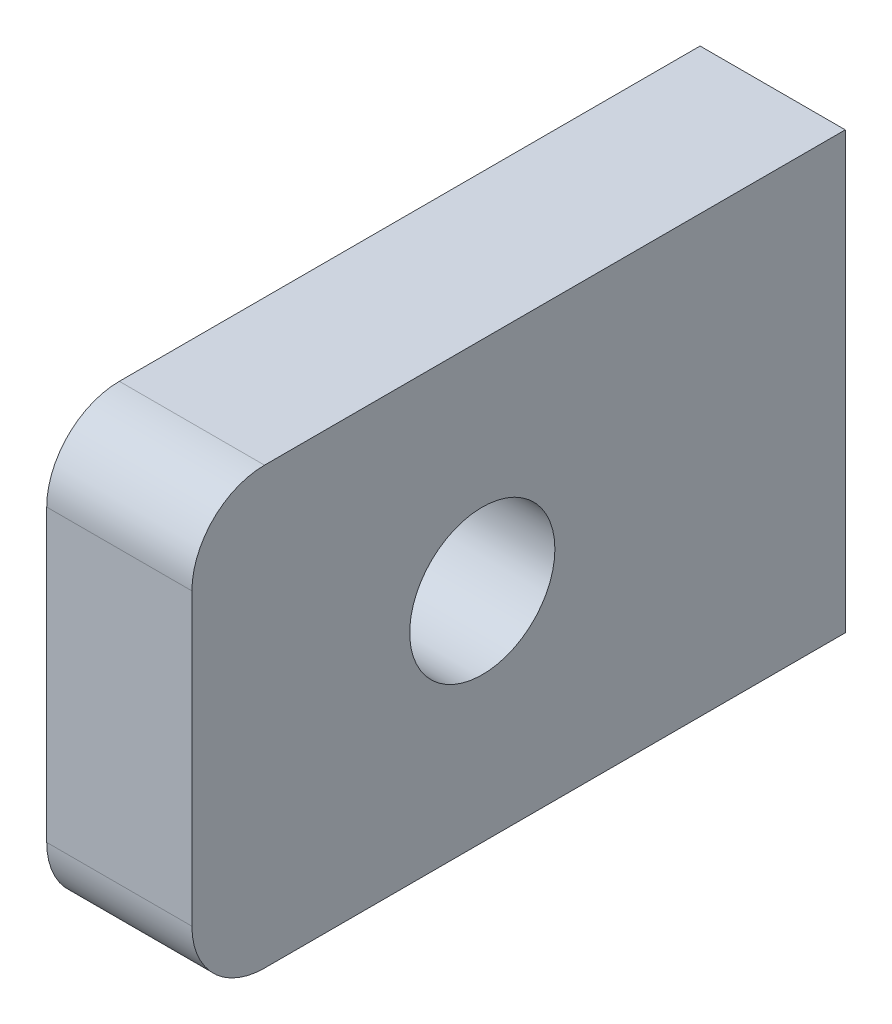
ISO-10303-21;
HEADER;
FILE_DESCRIPTION(('STEP AP214'),'2;1');
FILE_NAME('part.step','',(''),(''),'','','');
FILE_SCHEMA(('AUTOMOTIVE_DESIGN { 1 0 10303 214 1 1 1 1 }'));
ENDSEC;
DATA;
#1=APPLICATION_CONTEXT('core data for automotive mechanical design processes');
#2=APPLICATION_PROTOCOL_DEFINITION('international standard','automotive_design',2000,#1);
#3=PRODUCT_CONTEXT('',#1,'mechanical');
#4=PRODUCT('Part','Part','',(#3));
#5=PRODUCT_RELATED_PRODUCT_CATEGORY('part','',(#4));
#6=PRODUCT_DEFINITION_FORMATION('','',#4);
#7=PRODUCT_DEFINITION_CONTEXT('part definition',#1,'design');
#8=PRODUCT_DEFINITION('design','',#6,#7);
#9=PRODUCT_DEFINITION_SHAPE('','',#8);
#10=(LENGTH_UNIT() NAMED_UNIT(*) SI_UNIT(.MILLI.,.METRE.));
#11=(NAMED_UNIT(*) PLANE_ANGLE_UNIT() SI_UNIT($,.RADIAN.));
#12=(NAMED_UNIT(*) SI_UNIT($,.STERADIAN.) SOLID_ANGLE_UNIT());
#13=UNCERTAINTY_MEASURE_WITH_UNIT(LENGTH_MEASURE(1.E-05),#10,'distance_accuracy_value','');
#14=(GEOMETRIC_REPRESENTATION_CONTEXT(3) GLOBAL_UNCERTAINTY_ASSIGNED_CONTEXT((#13)) GLOBAL_UNIT_ASSIGNED_CONTEXT((#10,
#11,#12)) REPRESENTATION_CONTEXT('',''));
#15=CARTESIAN_POINT('',(0.,0.,0.));
#16=DIRECTION('',(0.,0.,1.));
#17=DIRECTION('',(1.,0.,0.));
#18=AXIS2_PLACEMENT_3D('',#15,#16,#17);
#19=CARTESIAN_POINT('',(20.,60.,-90.));
#20=DIRECTION('',(0.,0.,1.));
#21=DIRECTION('',(0.,-1.,0.));
#22=AXIS2_PLACEMENT_3D('',#19,#20,#21);
#23=PLANE('',#22);
#24=DIRECTION('',(0.,1.,0.));
#25=VECTOR('',#24,1.);
#26=CARTESIAN_POINT('',(-20.,60.,-90.));
#27=LINE('',#26,#25);
#28=CARTESIAN_POINT('',(-20.,-60.,-90.));
#29=VERTEX_POINT('',#28);
#30=CARTESIAN_POINT('',(-20.,60.,-90.));
#31=VERTEX_POINT('',#30);
#32=EDGE_CURVE('E93',#29,#31,#27,.T.);
#33=ORIENTED_EDGE('',*,*,#32,.T.);
#34=DIRECTION('',(-1.,0.,0.));
#35=VECTOR('',#34,1.);
#36=CARTESIAN_POINT('',(20.,60.,-90.));
#37=LINE('',#36,#35);
#38=CARTESIAN_POINT('',(20.,60.,-90.));
#39=VERTEX_POINT('',#38);
#40=EDGE_CURVE('E74',#39,#31,#37,.T.);
#41=ORIENTED_EDGE('',*,*,#40,.F.);
#42=DIRECTION('',(0.,1.,0.));
#43=VECTOR('',#42,1.);
#44=CARTESIAN_POINT('',(20.,60.,-90.));
#45=LINE('',#44,#43);
#46=CARTESIAN_POINT('',(20.,-60.,-90.));
#47=VERTEX_POINT('',#46);
#48=EDGE_CURVE('E80',#47,#39,#45,.T.);
#49=ORIENTED_EDGE('',*,*,#48,.F.);
#50=DIRECTION('',(-1.,0.,0.));
#51=VECTOR('',#50,1.);
#52=CARTESIAN_POINT('',(20.,-60.,-90.));
#53=LINE('',#52,#51);
#54=EDGE_CURVE('E96',#47,#29,#53,.T.);
#55=ORIENTED_EDGE('',*,*,#54,.T.);
#56=EDGE_LOOP('',(#33,#41,#49,#55));
#57=FACE_BOUND('',#56,.T.);
#58=ADVANCED_FACE('F17',(#57),#23,.F.);
#59=CARTESIAN_POINT('',(20.,60.,90.));
#60=DIRECTION('',(0.,-1.,0.));
#61=DIRECTION('',(0.,0.,-1.));
#62=AXIS2_PLACEMENT_3D('',#59,#60,#61);
#63=PLANE('',#62);
#64=DIRECTION('',(0.,0.,1.));
#65=VECTOR('',#64,1.);
#66=CARTESIAN_POINT('',(-20.,60.,90.));
#67=LINE('',#66,#65);
#68=CARTESIAN_POINT('',(-20.,60.,70.));
#69=VERTEX_POINT('',#68);
#70=EDGE_CURVE('E138',#31,#69,#67,.T.);
#71=ORIENTED_EDGE('',*,*,#70,.T.);
#72=DIRECTION('',(-1.,0.,0.));
#73=VECTOR('',#72,1.);
#74=CARTESIAN_POINT('',(20.,60.,70.));
#75=LINE('',#74,#73);
#76=CARTESIAN_POINT('',(20.,60.,70.));
#77=VERTEX_POINT('',#76);
#78=EDGE_CURVE('E11',#69,#77,#75,.F.);
#79=ORIENTED_EDGE('',*,*,#78,.T.);
#80=DIRECTION('',(0.,0.,1.));
#81=VECTOR('',#80,1.);
#82=CARTESIAN_POINT('',(20.,60.,90.));
#83=LINE('',#82,#81);
#84=EDGE_CURVE('E70',#39,#77,#83,.T.);
#85=ORIENTED_EDGE('',*,*,#84,.F.);
#86=ORIENTED_EDGE('',*,*,#40,.T.);
#87=EDGE_LOOP('',(#71,#79,#85,#86));
#88=FACE_BOUND('',#87,.T.);
#89=ADVANCED_FACE('F72',(#88),#63,.F.);
#90=CARTESIAN_POINT('',(20.,60.,90.));
#91=DIRECTION('',(0.,0.,-1.));
#92=DIRECTION('',(0.,1.,0.));
#93=AXIS2_PLACEMENT_3D('',#90,#91,#92);
#94=PLANE('',#93);
#95=DIRECTION('',(0.,-1.,0.));
#96=VECTOR('',#95,1.);
#97=CARTESIAN_POINT('',(-20.,60.,90.));
#98=LINE('',#97,#96);
#99=CARTESIAN_POINT('',(-20.,40.,90.));
#100=VERTEX_POINT('',#99);
#101=CARTESIAN_POINT('',(-20.,-40.,90.));
#102=VERTEX_POINT('',#101);
#103=EDGE_CURVE('E134',#100,#102,#98,.T.);
#104=ORIENTED_EDGE('',*,*,#103,.T.);
#105=DIRECTION('',(-1.,0.,0.));
#106=VECTOR('',#105,1.);
#107=CARTESIAN_POINT('',(20.,-40.,90.));
#108=LINE('',#107,#106);
#109=CARTESIAN_POINT('',(20.,-40.,90.));
#110=VERTEX_POINT('',#109);
#111=EDGE_CURVE('E39',#102,#110,#108,.F.);
#112=ORIENTED_EDGE('',*,*,#111,.T.);
#113=DIRECTION('',(0.,-1.,0.));
#114=VECTOR('',#113,1.);
#115=CARTESIAN_POINT('',(20.,60.,90.));
#116=LINE('',#115,#114);
#117=CARTESIAN_POINT('',(20.,40.,90.));
#118=VERTEX_POINT('',#117);
#119=EDGE_CURVE('E79',#118,#110,#116,.T.);
#120=ORIENTED_EDGE('',*,*,#119,.F.);
#121=DIRECTION('',(-1.,0.,0.));
#122=VECTOR('',#121,1.);
#123=CARTESIAN_POINT('',(20.,40.,90.));
#124=LINE('',#123,#122);
#125=EDGE_CURVE('E114',#118,#100,#124,.T.);
#126=ORIENTED_EDGE('',*,*,#125,.T.);
#127=EDGE_LOOP('',(#104,#112,#120,#126));
#128=FACE_BOUND('',#127,.T.);
#129=ADVANCED_FACE('F135',(#128),#94,.F.);
#130=CARTESIAN_POINT('',(20.,-60.,90.));
#131=DIRECTION('',(0.,1.,0.));
#132=DIRECTION('',(0.,0.,1.));
#133=AXIS2_PLACEMENT_3D('',#130,#131,#132);
#134=PLANE('',#133);
#135=DIRECTION('',(0.,0.,-1.));
#136=VECTOR('',#135,1.);
#137=CARTESIAN_POINT('',(20.,-60.,90.));
#138=LINE('',#137,#136);
#139=CARTESIAN_POINT('',(20.,-60.,70.));
#140=VERTEX_POINT('',#139);
#141=EDGE_CURVE('E85',#140,#47,#138,.T.);
#142=ORIENTED_EDGE('',*,*,#141,.F.);
#143=DIRECTION('',(-1.,0.,0.));
#144=VECTOR('',#143,1.);
#145=CARTESIAN_POINT('',(20.,-60.,70.));
#146=LINE('',#145,#144);
#147=CARTESIAN_POINT('',(-20.,-60.,70.));
#148=VERTEX_POINT('',#147);
#149=EDGE_CURVE('E95',#140,#148,#146,.T.);
#150=ORIENTED_EDGE('',*,*,#149,.T.);
#151=DIRECTION('',(0.,0.,-1.));
#152=VECTOR('',#151,1.);
#153=CARTESIAN_POINT('',(-20.,-60.,90.));
#154=LINE('',#153,#152);
#155=EDGE_CURVE('E90',#148,#29,#154,.T.);
#156=ORIENTED_EDGE('',*,*,#155,.T.);
#157=ORIENTED_EDGE('',*,*,#54,.F.);
#158=EDGE_LOOP('',(#142,#150,#156,#157));
#159=FACE_BOUND('',#158,.T.);
#160=ADVANCED_FACE('F126',(#159),#134,.F.);
#161=CARTESIAN_POINT('',(20.,0.,0.));
#162=DIRECTION('',(1.,0.,0.));
#163=DIRECTION('',(0.,0.,-1.));
#164=AXIS2_PLACEMENT_3D('',#161,#162,#163);
#165=PLANE('',#164);
#166=CARTESIAN_POINT('',(20.,0.,10.));
#167=DIRECTION('',(1.,0.,0.));
#168=DIRECTION('',(0.,0.,-1.));
#169=AXIS2_PLACEMENT_3D('',#166,#167,#168);
#170=CIRCLE('',#169,20.);
#171=CARTESIAN_POINT('',(20.,0.,-10.));
#172=VERTEX_POINT('',#171);
#173=EDGE_CURVE('E154',#172,#172,#170,.T.);
#174=ORIENTED_EDGE('',*,*,#173,.F.);
#175=EDGE_LOOP('',(#174));
#176=FACE_BOUND('',#175,.T.);
#177=ORIENTED_EDGE('',*,*,#119,.T.);
#178=CARTESIAN_POINT('',(20.,-40.,70.));
#179=DIRECTION('',(1.,0.,0.));
#180=DIRECTION('',(0.,0.,-1.));
#181=AXIS2_PLACEMENT_3D('',#178,#179,#180);
#182=CIRCLE('',#181,20.);
#183=EDGE_CURVE('E26',#110,#140,#182,.T.);
#184=ORIENTED_EDGE('',*,*,#183,.T.);
#185=ORIENTED_EDGE('',*,*,#141,.T.);
#186=ORIENTED_EDGE('',*,*,#48,.T.);
#187=ORIENTED_EDGE('',*,*,#84,.T.);
#188=CARTESIAN_POINT('',(20.,40.,70.));
#189=DIRECTION('',(1.,0.,0.));
#190=DIRECTION('',(0.,0.,-1.));
#191=AXIS2_PLACEMENT_3D('',#188,#189,#190);
#192=CIRCLE('',#191,20.);
#193=EDGE_CURVE('E120',#77,#118,#192,.T.);
#194=ORIENTED_EDGE('',*,*,#193,.T.);
#195=EDGE_LOOP('',(#177,#184,#185,#186,#187,#194));
#196=FACE_BOUND('',#195,.T.);
#197=ADVANCED_FACE('F83',(#176,#196),#165,.T.);
#198=CARTESIAN_POINT('',(-20.,0.,0.));
#199=DIRECTION('',(1.,0.,0.));
#200=DIRECTION('',(0.,0.,-1.));
#201=AXIS2_PLACEMENT_3D('',#198,#199,#200);
#202=PLANE('',#201);
#203=CARTESIAN_POINT('',(-20.,0.,10.));
#204=DIRECTION('',(1.,0.,0.));
#205=DIRECTION('',(0.,0.,-1.));
#206=AXIS2_PLACEMENT_3D('',#203,#204,#205);
#207=CIRCLE('',#206,20.);
#208=CARTESIAN_POINT('',(-20.,0.,-10.));
#209=VERTEX_POINT('',#208);
#210=EDGE_CURVE('E147',#209,#209,#207,.F.);
#211=ORIENTED_EDGE('',*,*,#210,.F.);
#212=EDGE_LOOP('',(#211));
#213=FACE_BOUND('',#212,.T.);
#214=ORIENTED_EDGE('',*,*,#155,.F.);
#215=CARTESIAN_POINT('',(-20.,-40.,70.));
#216=DIRECTION('',(1.,0.,0.));
#217=DIRECTION('',(0.,0.,-1.));
#218=AXIS2_PLACEMENT_3D('',#215,#216,#217);
#219=CIRCLE('',#218,20.);
#220=EDGE_CURVE('E111',#148,#102,#219,.F.);
#221=ORIENTED_EDGE('',*,*,#220,.T.);
#222=ORIENTED_EDGE('',*,*,#103,.F.);
#223=CARTESIAN_POINT('',(-20.,40.,70.));
#224=DIRECTION('',(1.,0.,0.));
#225=DIRECTION('',(0.,0.,-1.));
#226=AXIS2_PLACEMENT_3D('',#223,#224,#225);
#227=CIRCLE('',#226,20.);
#228=EDGE_CURVE('E103',#100,#69,#227,.F.);
#229=ORIENTED_EDGE('',*,*,#228,.T.);
#230=ORIENTED_EDGE('',*,*,#70,.F.);
#231=ORIENTED_EDGE('',*,*,#32,.F.);
#232=EDGE_LOOP('',(#214,#221,#222,#229,#230,#231));
#233=FACE_BOUND('',#232,.T.);
#234=ADVANCED_FACE('F133',(#213,#233),#202,.F.);
#235=CARTESIAN_POINT('',(-20.001,0.,10.));
#236=DIRECTION('',(1.,0.,0.));
#237=DIRECTION('',(0.,0.,-1.));
#238=AXIS2_PLACEMENT_3D('',#235,#236,#237);
#239=CYLINDRICAL_SURFACE('',#238,20.);
#240=ORIENTED_EDGE('',*,*,#173,.T.);
#241=EDGE_LOOP('',(#240));
#242=FACE_BOUND('',#241,.T.);
#243=ORIENTED_EDGE('',*,*,#210,.T.);
#244=EDGE_LOOP('',(#243));
#245=FACE_BOUND('',#244,.T.);
#246=ADVANCED_FACE('F159',(#242,#245),#239,.F.);
#247=CARTESIAN_POINT('',(20.,-40.,70.));
#248=DIRECTION('',(-1.,0.,0.));
#249=DIRECTION('',(0.,0.,1.));
#250=AXIS2_PLACEMENT_3D('',#247,#248,#249);
#251=CYLINDRICAL_SURFACE('',#250,20.);
#252=ORIENTED_EDGE('',*,*,#183,.F.);
#253=ORIENTED_EDGE('',*,*,#111,.F.);
#254=ORIENTED_EDGE('',*,*,#220,.F.);
#255=ORIENTED_EDGE('',*,*,#149,.F.);
#256=EDGE_LOOP('',(#252,#253,#254,#255));
#257=FACE_BOUND('',#256,.T.);
#258=ADVANCED_FACE('F130',(#257),#251,.T.);
#259=CARTESIAN_POINT('',(20.,40.,70.));
#260=DIRECTION('',(-1.,0.,0.));
#261=DIRECTION('',(0.,0.,1.));
#262=AXIS2_PLACEMENT_3D('',#259,#260,#261);
#263=CYLINDRICAL_SURFACE('',#262,20.);
#264=ORIENTED_EDGE('',*,*,#193,.F.);
#265=ORIENTED_EDGE('',*,*,#78,.F.);
#266=ORIENTED_EDGE('',*,*,#228,.F.);
#267=ORIENTED_EDGE('',*,*,#125,.F.);
#268=EDGE_LOOP('',(#264,#265,#266,#267));
#269=FACE_BOUND('',#268,.T.);
#270=ADVANCED_FACE('F19',(#269),#263,.T.);
#271=CLOSED_SHELL('',(#58,#89,#129,#160,#197,#234,#246,#258,#270));
#272=MANIFOLD_SOLID_BREP('B1',#271);
#273=ADVANCED_BREP_SHAPE_REPRESENTATION('',(#18,#272),#14);
#274=SHAPE_DEFINITION_REPRESENTATION(#9,#273);
ENDSEC;
END-ISO-10303-21;
